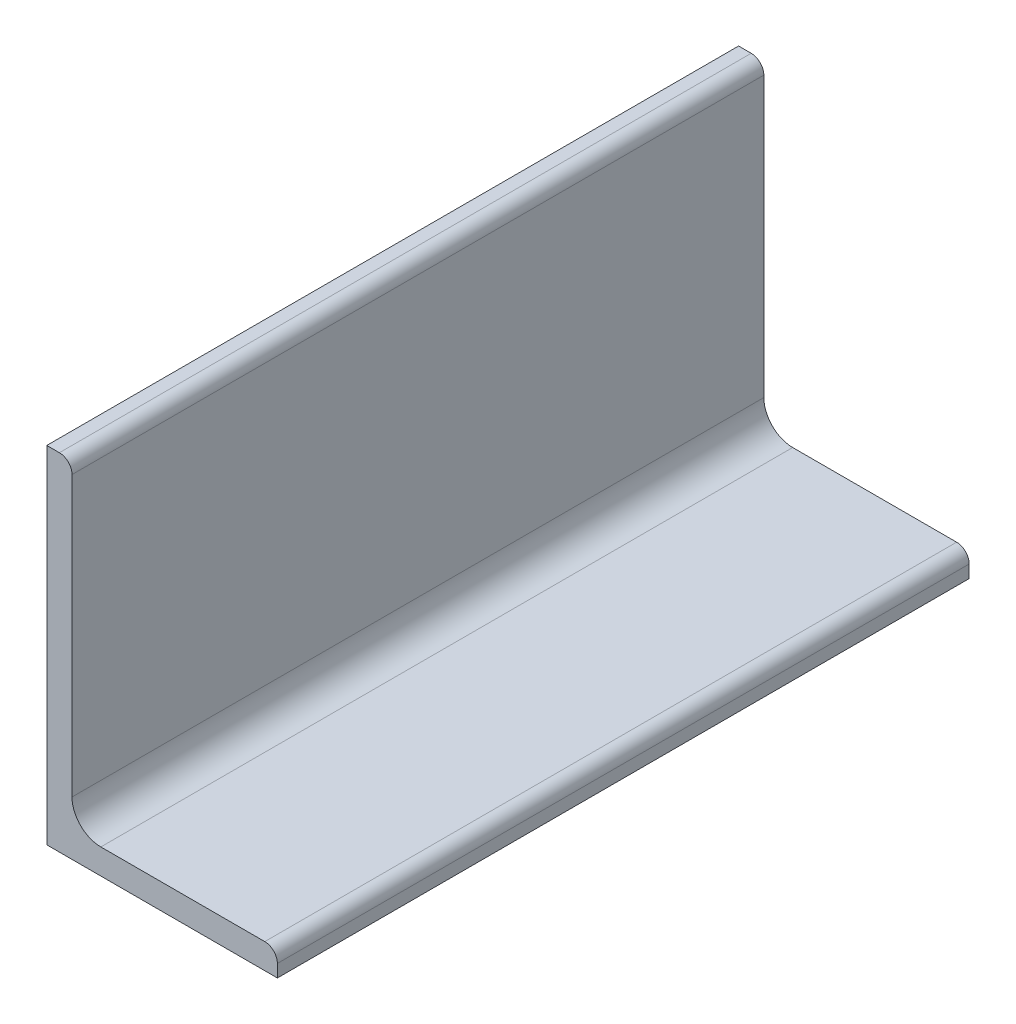
ISO-10303-21;
HEADER;
FILE_DESCRIPTION(('STEP AP214'),'2;1');
FILE_NAME('part.step','',(''),(''),'','','');
FILE_SCHEMA(('AUTOMOTIVE_DESIGN { 1 0 10303 214 1 1 1 1 }'));
ENDSEC;
DATA;
#1=APPLICATION_CONTEXT('core data for automotive mechanical design processes');
#2=APPLICATION_PROTOCOL_DEFINITION('international standard','automotive_design',2000,#1);
#3=PRODUCT_CONTEXT('',#1,'mechanical');
#4=PRODUCT('Part','Part','',(#3));
#5=PRODUCT_RELATED_PRODUCT_CATEGORY('part','',(#4));
#6=PRODUCT_DEFINITION_FORMATION('','',#4);
#7=PRODUCT_DEFINITION_CONTEXT('part definition',#1,'design');
#8=PRODUCT_DEFINITION('design','',#6,#7);
#9=PRODUCT_DEFINITION_SHAPE('','',#8);
#10=(LENGTH_UNIT() NAMED_UNIT(*) SI_UNIT(.MILLI.,.METRE.));
#11=(NAMED_UNIT(*) PLANE_ANGLE_UNIT() SI_UNIT($,.RADIAN.));
#12=(NAMED_UNIT(*) SI_UNIT($,.STERADIAN.) SOLID_ANGLE_UNIT());
#13=UNCERTAINTY_MEASURE_WITH_UNIT(LENGTH_MEASURE(1.E-05),#10,'distance_accuracy_value','');
#14=(GEOMETRIC_REPRESENTATION_CONTEXT(3) GLOBAL_UNCERTAINTY_ASSIGNED_CONTEXT((#13)) GLOBAL_UNIT_ASSIGNED_CONTEXT((#10,
#11,#12)) REPRESENTATION_CONTEXT('',''));
#15=CARTESIAN_POINT('',(0.,0.,0.));
#16=DIRECTION('',(0.,0.,1.));
#17=DIRECTION('',(1.,0.,0.));
#18=AXIS2_PLACEMENT_3D('',#15,#16,#17);
#19=CARTESIAN_POINT('',(0.865045893659089,152.925428131371,304.8));
#20=DIRECTION('',(1.,0.,0.));
#21=DIRECTION('',(0.,0.,-1.));
#22=AXIS2_PLACEMENT_3D('',#19,#20,#21);
#23=PLANE('',#22);
#24=DIRECTION('',(0.,-1.,0.));
#25=VECTOR('',#24,1.);
#26=CARTESIAN_POINT('',(0.865045893659089,152.925428131371,0.));
#27=LINE('',#26,#25);
#28=CARTESIAN_POINT('',(0.865045893659089,152.925428131371,0.));
#29=VERTEX_POINT('',#28);
#30=CARTESIAN_POINT('',(0.865045893659089,0.525428131371291,0.));
#31=VERTEX_POINT('',#30);
#32=EDGE_CURVE('E135',#29,#31,#27,.T.);
#33=ORIENTED_EDGE('',*,*,#32,.T.);
#34=DIRECTION('',(0.,0.,-1.));
#35=VECTOR('',#34,1.);
#36=CARTESIAN_POINT('',(0.865045893659089,0.525428131371291,304.8));
#37=LINE('',#36,#35);
#38=CARTESIAN_POINT('',(0.865045893659089,0.525428131371291,304.8));
#39=VERTEX_POINT('',#38);
#40=EDGE_CURVE('E11',#39,#31,#37,.T.);
#41=ORIENTED_EDGE('',*,*,#40,.F.);
#42=DIRECTION('',(0.,-1.,0.));
#43=VECTOR('',#42,1.);
#44=CARTESIAN_POINT('',(0.865045893659089,152.925428131371,304.8));
#45=LINE('',#44,#43);
#46=CARTESIAN_POINT('',(0.865045893659089,152.925428131371,304.8));
#47=VERTEX_POINT('',#46);
#48=EDGE_CURVE('E151',#47,#39,#45,.T.);
#49=ORIENTED_EDGE('',*,*,#48,.F.);
#50=DIRECTION('',(0.,0.,-1.));
#51=VECTOR('',#50,1.);
#52=CARTESIAN_POINT('',(0.865045893659089,152.925428131371,304.8));
#53=LINE('',#52,#51);
#54=EDGE_CURVE('E131',#47,#29,#53,.T.);
#55=ORIENTED_EDGE('',*,*,#54,.T.);
#56=EDGE_LOOP('',(#33,#41,#49,#55));
#57=FACE_BOUND('',#56,.T.);
#58=ADVANCED_FACE('F33',(#57),#23,.F.);
#59=CARTESIAN_POINT('',(0.865045893659089,0.525428131371291,304.8));
#60=DIRECTION('',(0.,1.,0.));
#61=DIRECTION('',(0.,0.,1.));
#62=AXIS2_PLACEMENT_3D('',#59,#60,#61);
#63=PLANE('',#62);
#64=DIRECTION('',(1.,0.,0.));
#65=VECTOR('',#64,1.);
#66=CARTESIAN_POINT('',(0.865045893659089,0.525428131371291,0.));
#67=LINE('',#66,#65);
#68=CARTESIAN_POINT('',(102.465045893659,0.525428131371291,0.));
#69=VERTEX_POINT('',#68);
#70=EDGE_CURVE('E138',#31,#69,#67,.T.);
#71=ORIENTED_EDGE('',*,*,#70,.T.);
#72=DIRECTION('',(0.,0.,-1.));
#73=VECTOR('',#72,1.);
#74=CARTESIAN_POINT('',(102.465045893659,0.525428131371291,304.8));
#75=LINE('',#74,#73);
#76=CARTESIAN_POINT('',(102.465045893659,0.525428131371291,304.8));
#77=VERTEX_POINT('',#76);
#78=EDGE_CURVE('E41',#77,#69,#75,.T.);
#79=ORIENTED_EDGE('',*,*,#78,.F.);
#80=DIRECTION('',(1.,0.,0.));
#81=VECTOR('',#80,1.);
#82=CARTESIAN_POINT('',(0.865045893659089,0.525428131371291,304.8));
#83=LINE('',#82,#81);
#84=EDGE_CURVE('E95',#39,#77,#83,.T.);
#85=ORIENTED_EDGE('',*,*,#84,.F.);
#86=ORIENTED_EDGE('',*,*,#40,.T.);
#87=EDGE_LOOP('',(#71,#79,#85,#86));
#88=FACE_BOUND('',#87,.T.);
#89=ADVANCED_FACE('F194',(#88),#63,.F.);
#90=CARTESIAN_POINT('',(102.465045893659,0.525428131371291,304.8));
#91=DIRECTION('',(-1.,0.,0.));
#92=DIRECTION('',(0.,0.,1.));
#93=AXIS2_PLACEMENT_3D('',#90,#91,#92);
#94=PLANE('',#93);
#95=DIRECTION('',(0.,1.,0.));
#96=VECTOR('',#95,1.);
#97=CARTESIAN_POINT('',(102.465045893659,0.525428131371291,0.));
#98=LINE('',#97,#96);
#99=CARTESIAN_POINT('',(102.465045893659,6.08167813137129,0.));
#100=VERTEX_POINT('',#99);
#101=EDGE_CURVE('E140',#69,#100,#98,.T.);
#102=ORIENTED_EDGE('',*,*,#101,.T.);
#103=DIRECTION('',(0.,0.,-1.));
#104=VECTOR('',#103,1.);
#105=CARTESIAN_POINT('',(102.465045893659,6.08167813137129,304.8));
#106=LINE('',#105,#104);
#107=CARTESIAN_POINT('',(102.465045893659,6.08167813137129,304.8));
#108=VERTEX_POINT('',#107);
#109=EDGE_CURVE('E161',#108,#100,#106,.T.);
#110=ORIENTED_EDGE('',*,*,#109,.F.);
#111=DIRECTION('',(0.,1.,0.));
#112=VECTOR('',#111,1.);
#113=CARTESIAN_POINT('',(102.465045893659,0.525428131371291,304.8));
#114=LINE('',#113,#112);
#115=EDGE_CURVE('E169',#77,#108,#114,.T.);
#116=ORIENTED_EDGE('',*,*,#115,.F.);
#117=ORIENTED_EDGE('',*,*,#78,.T.);
#118=EDGE_LOOP('',(#102,#110,#116,#117));
#119=FACE_BOUND('',#118,.T.);
#120=ADVANCED_FACE('F167',(#119),#94,.F.);
#121=CARTESIAN_POINT('',(96.9087958936591,6.08167813137129,304.8));
#122=DIRECTION('',(0.,0.,-1.));
#123=DIRECTION('',(-1.,0.,0.));
#124=AXIS2_PLACEMENT_3D('',#121,#122,#123);
#125=CYLINDRICAL_SURFACE('',#124,5.55625000000001);
#126=CARTESIAN_POINT('',(96.9087958936591,6.08167813137129,0.));
#127=DIRECTION('',(0.,0.,1.));
#128=DIRECTION('',(1.,0.,0.));
#129=AXIS2_PLACEMENT_3D('',#126,#127,#128);
#130=CIRCLE('',#129,5.55625000000001);
#131=CARTESIAN_POINT('',(96.9087958936591,11.6379281313713,0.));
#132=VERTEX_POINT('',#131);
#133=EDGE_CURVE('E142',#100,#132,#130,.T.);
#134=ORIENTED_EDGE('',*,*,#133,.T.);
#135=DIRECTION('',(0.,0.,-1.));
#136=VECTOR('',#135,1.);
#137=CARTESIAN_POINT('',(96.9087958936591,11.6379281313713,304.8));
#138=LINE('',#137,#136);
#139=CARTESIAN_POINT('',(96.9087958936591,11.6379281313713,304.8));
#140=VERTEX_POINT('',#139);
#141=EDGE_CURVE('E158',#140,#132,#138,.T.);
#142=ORIENTED_EDGE('',*,*,#141,.F.);
#143=CARTESIAN_POINT('',(96.9087958936591,6.08167813137129,304.8));
#144=DIRECTION('',(0.,0.,1.));
#145=DIRECTION('',(1.,0.,0.));
#146=AXIS2_PLACEMENT_3D('',#143,#144,#145);
#147=CIRCLE('',#146,5.55625000000001);
#148=EDGE_CURVE('E185',#108,#140,#147,.T.);
#149=ORIENTED_EDGE('',*,*,#148,.F.);
#150=ORIENTED_EDGE('',*,*,#109,.T.);
#151=EDGE_LOOP('',(#134,#142,#149,#150));
#152=FACE_BOUND('',#151,.T.);
#153=ADVANCED_FACE('F178',(#152),#125,.T.);
#154=CARTESIAN_POINT('',(96.9087958936591,11.6379281313713,304.8));
#155=DIRECTION('',(0.,-1.,0.));
#156=DIRECTION('',(0.,0.,-1.));
#157=AXIS2_PLACEMENT_3D('',#154,#155,#156);
#158=PLANE('',#157);
#159=DIRECTION('',(-1.,0.,0.));
#160=VECTOR('',#159,1.);
#161=CARTESIAN_POINT('',(96.9087958936591,11.6379281313713,0.));
#162=LINE('',#161,#160);
#163=CARTESIAN_POINT('',(24.6775458936591,11.6379281313713,0.));
#164=VERTEX_POINT('',#163);
#165=EDGE_CURVE('E144',#132,#164,#162,.T.);
#166=ORIENTED_EDGE('',*,*,#165,.T.);
#167=DIRECTION('',(0.,0.,-1.));
#168=VECTOR('',#167,1.);
#169=CARTESIAN_POINT('',(24.6775458936591,11.6379281313713,304.8));
#170=LINE('',#169,#168);
#171=CARTESIAN_POINT('',(24.6775458936591,11.6379281313713,304.8));
#172=VERTEX_POINT('',#171);
#173=EDGE_CURVE('E155',#172,#164,#170,.T.);
#174=ORIENTED_EDGE('',*,*,#173,.F.);
#175=DIRECTION('',(-1.,0.,0.));
#176=VECTOR('',#175,1.);
#177=CARTESIAN_POINT('',(96.9087958936591,11.6379281313713,304.8));
#178=LINE('',#177,#176);
#179=EDGE_CURVE('E184',#140,#172,#178,.T.);
#180=ORIENTED_EDGE('',*,*,#179,.F.);
#181=ORIENTED_EDGE('',*,*,#141,.T.);
#182=EDGE_LOOP('',(#166,#174,#180,#181));
#183=FACE_BOUND('',#182,.T.);
#184=ADVANCED_FACE('F182',(#183),#158,.F.);
#185=CARTESIAN_POINT('',(24.6775458936591,24.3379281313713,304.8));
#186=DIRECTION('',(0.,0.,-1.));
#187=DIRECTION('',(-1.,0.,0.));
#188=AXIS2_PLACEMENT_3D('',#185,#186,#187);
#189=CYLINDRICAL_SURFACE('',#188,12.7);
#190=CARTESIAN_POINT('',(24.6775458936591,24.3379281313713,0.));
#191=DIRECTION('',(0.,0.,-1.));
#192=DIRECTION('',(1.,0.,0.));
#193=AXIS2_PLACEMENT_3D('',#190,#191,#192);
#194=CIRCLE('',#193,12.7);
#195=CARTESIAN_POINT('',(11.9775458936591,24.3379281313713,0.));
#196=VERTEX_POINT('',#195);
#197=EDGE_CURVE('E146',#164,#196,#194,.T.);
#198=ORIENTED_EDGE('',*,*,#197,.T.);
#199=DIRECTION('',(0.,0.,-1.));
#200=VECTOR('',#199,1.);
#201=CARTESIAN_POINT('',(11.9775458936591,24.3379281313713,304.8));
#202=LINE('',#201,#200);
#203=CARTESIAN_POINT('',(11.9775458936591,24.3379281313713,304.8));
#204=VERTEX_POINT('',#203);
#205=EDGE_CURVE('E126',#204,#196,#202,.T.);
#206=ORIENTED_EDGE('',*,*,#205,.F.);
#207=CARTESIAN_POINT('',(24.6775458936591,24.3379281313713,304.8));
#208=DIRECTION('',(0.,0.,-1.));
#209=DIRECTION('',(1.,0.,0.));
#210=AXIS2_PLACEMENT_3D('',#207,#208,#209);
#211=CIRCLE('',#210,12.7);
#212=EDGE_CURVE('E117',#172,#204,#211,.T.);
#213=ORIENTED_EDGE('',*,*,#212,.F.);
#214=ORIENTED_EDGE('',*,*,#173,.T.);
#215=EDGE_LOOP('',(#198,#206,#213,#214));
#216=FACE_BOUND('',#215,.T.);
#217=ADVANCED_FACE('F206',(#216),#189,.F.);
#218=CARTESIAN_POINT('',(11.9775458936591,24.3379281313713,304.8));
#219=DIRECTION('',(-1.,0.,0.));
#220=DIRECTION('',(0.,0.,1.));
#221=AXIS2_PLACEMENT_3D('',#218,#219,#220);
#222=PLANE('',#221);
#223=DIRECTION('',(0.,1.,0.));
#224=VECTOR('',#223,1.);
#225=CARTESIAN_POINT('',(11.9775458936591,24.3379281313713,0.));
#226=LINE('',#225,#224);
#227=CARTESIAN_POINT('',(11.9775458936591,147.369178131371,0.));
#228=VERTEX_POINT('',#227);
#229=EDGE_CURVE('E125',#196,#228,#226,.T.);
#230=ORIENTED_EDGE('',*,*,#229,.T.);
#231=DIRECTION('',(0.,0.,-1.));
#232=VECTOR('',#231,1.);
#233=CARTESIAN_POINT('',(11.9775458936591,147.369178131371,304.8));
#234=LINE('',#233,#232);
#235=CARTESIAN_POINT('',(11.9775458936591,147.369178131371,304.8));
#236=VERTEX_POINT('',#235);
#237=EDGE_CURVE('E122',#236,#228,#234,.T.);
#238=ORIENTED_EDGE('',*,*,#237,.F.);
#239=DIRECTION('',(0.,1.,0.));
#240=VECTOR('',#239,1.);
#241=CARTESIAN_POINT('',(11.9775458936591,24.3379281313713,304.8));
#242=LINE('',#241,#240);
#243=EDGE_CURVE('E111',#204,#236,#242,.T.);
#244=ORIENTED_EDGE('',*,*,#243,.F.);
#245=ORIENTED_EDGE('',*,*,#205,.T.);
#246=EDGE_LOOP('',(#230,#238,#244,#245));
#247=FACE_BOUND('',#246,.T.);
#248=ADVANCED_FACE('F123',(#247),#222,.F.);
#249=CARTESIAN_POINT('',(6.42129589365909,147.369178131371,304.8));
#250=DIRECTION('',(0.,0.,-1.));
#251=DIRECTION('',(-1.,0.,0.));
#252=AXIS2_PLACEMENT_3D('',#249,#250,#251);
#253=CYLINDRICAL_SURFACE('',#252,5.55624999999999);
#254=CARTESIAN_POINT('',(6.42129589365909,147.369178131371,0.));
#255=DIRECTION('',(0.,0.,1.));
#256=DIRECTION('',(1.,0.,0.));
#257=AXIS2_PLACEMENT_3D('',#254,#255,#256);
#258=CIRCLE('',#257,5.55624999999999);
#259=CARTESIAN_POINT('',(6.42129589365909,152.925428131371,0.));
#260=VERTEX_POINT('',#259);
#261=EDGE_CURVE('E81',#228,#260,#258,.T.);
#262=ORIENTED_EDGE('',*,*,#261,.T.);
#263=DIRECTION('',(0.,0.,-1.));
#264=VECTOR('',#263,1.);
#265=CARTESIAN_POINT('',(6.42129589365909,152.925428131371,304.8));
#266=LINE('',#265,#264);
#267=CARTESIAN_POINT('',(6.42129589365909,152.925428131371,304.8));
#268=VERTEX_POINT('',#267);
#269=EDGE_CURVE('E127',#268,#260,#266,.T.);
#270=ORIENTED_EDGE('',*,*,#269,.F.);
#271=CARTESIAN_POINT('',(6.42129589365909,147.369178131371,304.8));
#272=DIRECTION('',(0.,0.,1.));
#273=DIRECTION('',(1.,0.,0.));
#274=AXIS2_PLACEMENT_3D('',#271,#272,#273);
#275=CIRCLE('',#274,5.55624999999999);
#276=EDGE_CURVE('E115',#236,#268,#275,.T.);
#277=ORIENTED_EDGE('',*,*,#276,.F.);
#278=ORIENTED_EDGE('',*,*,#237,.T.);
#279=EDGE_LOOP('',(#262,#270,#277,#278));
#280=FACE_BOUND('',#279,.T.);
#281=ADVANCED_FACE('F129',(#280),#253,.T.);
#282=CARTESIAN_POINT('',(6.42129589365909,152.925428131371,304.8));
#283=DIRECTION('',(0.,-1.,0.));
#284=DIRECTION('',(0.,0.,-1.));
#285=AXIS2_PLACEMENT_3D('',#282,#283,#284);
#286=PLANE('',#285);
#287=DIRECTION('',(-1.,0.,0.));
#288=VECTOR('',#287,1.);
#289=CARTESIAN_POINT('',(6.42129589365909,152.925428131371,0.));
#290=LINE('',#289,#288);
#291=EDGE_CURVE('E87',#260,#29,#290,.T.);
#292=ORIENTED_EDGE('',*,*,#291,.T.);
#293=ORIENTED_EDGE('',*,*,#54,.F.);
#294=DIRECTION('',(-1.,0.,0.));
#295=VECTOR('',#294,1.);
#296=CARTESIAN_POINT('',(6.42129589365909,152.925428131371,304.8));
#297=LINE('',#296,#295);
#298=EDGE_CURVE('E49',#268,#47,#297,.T.);
#299=ORIENTED_EDGE('',*,*,#298,.F.);
#300=ORIENTED_EDGE('',*,*,#269,.T.);
#301=EDGE_LOOP('',(#292,#293,#299,#300));
#302=FACE_BOUND('',#301,.T.);
#303=ADVANCED_FACE('F214',(#302),#286,.F.);
#304=CARTESIAN_POINT('',(96.9087958936591,6.08167813137129,304.8));
#305=DIRECTION('',(0.,0.,1.));
#306=DIRECTION('',(1.,0.,0.));
#307=AXIS2_PLACEMENT_3D('',#304,#305,#306);
#308=PLANE('',#307);
#309=ORIENTED_EDGE('',*,*,#48,.T.);
#310=ORIENTED_EDGE('',*,*,#84,.T.);
#311=ORIENTED_EDGE('',*,*,#115,.T.);
#312=ORIENTED_EDGE('',*,*,#148,.T.);
#313=ORIENTED_EDGE('',*,*,#179,.T.);
#314=ORIENTED_EDGE('',*,*,#212,.T.);
#315=ORIENTED_EDGE('',*,*,#243,.T.);
#316=ORIENTED_EDGE('',*,*,#276,.T.);
#317=ORIENTED_EDGE('',*,*,#298,.T.);
#318=EDGE_LOOP('',(#309,#310,#311,#312,#313,#314,#315,#316,#317));
#319=FACE_BOUND('',#318,.T.);
#320=ADVANCED_FACE('F113',(#319),#308,.T.);
#321=CARTESIAN_POINT('',(96.9087958936591,6.08167813137129,0.));
#322=DIRECTION('',(0.,0.,1.));
#323=DIRECTION('',(1.,0.,0.));
#324=AXIS2_PLACEMENT_3D('',#321,#322,#323);
#325=PLANE('',#324);
#326=ORIENTED_EDGE('',*,*,#32,.F.);
#327=ORIENTED_EDGE('',*,*,#291,.F.);
#328=ORIENTED_EDGE('',*,*,#261,.F.);
#329=ORIENTED_EDGE('',*,*,#229,.F.);
#330=ORIENTED_EDGE('',*,*,#197,.F.);
#331=ORIENTED_EDGE('',*,*,#165,.F.);
#332=ORIENTED_EDGE('',*,*,#133,.F.);
#333=ORIENTED_EDGE('',*,*,#101,.F.);
#334=ORIENTED_EDGE('',*,*,#70,.F.);
#335=EDGE_LOOP('',(#326,#327,#328,#329,#330,#331,#332,#333,#334));
#336=FACE_BOUND('',#335,.T.);
#337=ADVANCED_FACE('F173',(#336),#325,.F.);
#338=CLOSED_SHELL('',(#58,#89,#120,#153,#184,#217,#248,#281,#303,#320,#337));
#339=MANIFOLD_SOLID_BREP('B2',#338);
#340=ADVANCED_BREP_SHAPE_REPRESENTATION('',(#18,#339),#14);
#341=SHAPE_DEFINITION_REPRESENTATION(#9,#340);
ENDSEC;
END-ISO-10303-21;
